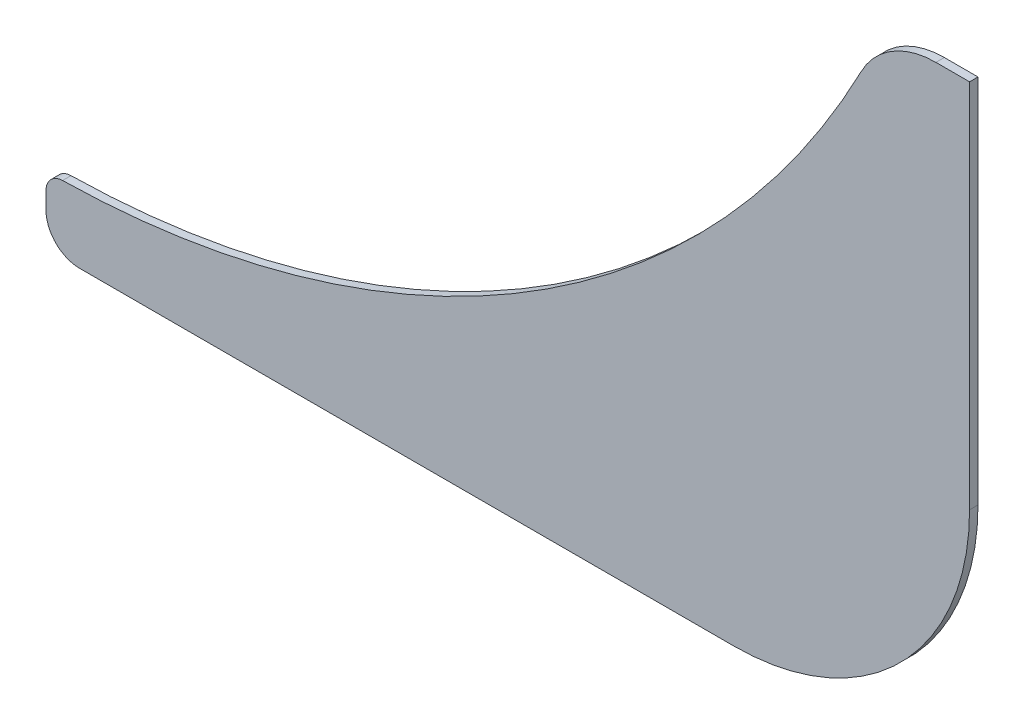
ISO-10303-21;
HEADER;
FILE_DESCRIPTION(('STEP AP214'),'2;1');
FILE_NAME('part.step','',(''),(''),'','','');
FILE_SCHEMA(('AUTOMOTIVE_DESIGN { 1 0 10303 214 1 1 1 1 }'));
ENDSEC;
DATA;
#1=APPLICATION_CONTEXT('core data for automotive mechanical design processes');
#2=APPLICATION_PROTOCOL_DEFINITION('international standard','automotive_design',2000,#1);
#3=PRODUCT_CONTEXT('',#1,'mechanical');
#4=PRODUCT('Part','Part','',(#3));
#5=PRODUCT_RELATED_PRODUCT_CATEGORY('part','',(#4));
#6=PRODUCT_DEFINITION_FORMATION('','',#4);
#7=PRODUCT_DEFINITION_CONTEXT('part definition',#1,'design');
#8=PRODUCT_DEFINITION('design','',#6,#7);
#9=PRODUCT_DEFINITION_SHAPE('','',#8);
#10=(LENGTH_UNIT() NAMED_UNIT(*) SI_UNIT(.MILLI.,.METRE.));
#11=(NAMED_UNIT(*) PLANE_ANGLE_UNIT() SI_UNIT($,.RADIAN.));
#12=(NAMED_UNIT(*) SI_UNIT($,.STERADIAN.) SOLID_ANGLE_UNIT());
#13=UNCERTAINTY_MEASURE_WITH_UNIT(LENGTH_MEASURE(1.E-05),#10,'distance_accuracy_value','');
#14=(GEOMETRIC_REPRESENTATION_CONTEXT(3) GLOBAL_UNCERTAINTY_ASSIGNED_CONTEXT((#13)) GLOBAL_UNIT_ASSIGNED_CONTEXT((#10,
#11,#12)) REPRESENTATION_CONTEXT('',''));
#15=CARTESIAN_POINT('',(0.,0.,0.));
#16=DIRECTION('',(0.,0.,1.));
#17=DIRECTION('',(1.,0.,0.));
#18=AXIS2_PLACEMENT_3D('',#15,#16,#17);
#19=CARTESIAN_POINT('',(-3.71924713249424E-13,170.179999999999,6.35));
#20=DIRECTION('',(0.,-1.,0.));
#21=DIRECTION('',(1.,0.,0.));
#22=AXIS2_PLACEMENT_3D('',#19,#20,#21);
#23=PLANE('',#22);
#24=DIRECTION('',(-1.,0.,0.));
#25=VECTOR('',#24,1.);
#26=CARTESIAN_POINT('',(-3.71924713249424E-13,170.179999999999,0.));
#27=LINE('',#26,#25);
#28=CARTESIAN_POINT('',(588.24881144586,170.18,0.));
#29=VERTEX_POINT('',#28);
#30=CARTESIAN_POINT('',(562.84881144586,170.18,0.));
#31=VERTEX_POINT('',#30);
#32=EDGE_CURVE('E129',#29,#31,#27,.T.);
#33=ORIENTED_EDGE('',*,*,#32,.T.);
#34=DIRECTION('',(0.,0.,-1.));
#35=VECTOR('',#34,1.);
#36=CARTESIAN_POINT('',(562.84881144586,170.18,6.35));
#37=LINE('',#36,#35);
#38=CARTESIAN_POINT('',(562.84881144586,170.18,6.35));
#39=VERTEX_POINT('',#38);
#40=EDGE_CURVE('E110',#39,#31,#37,.T.);
#41=ORIENTED_EDGE('',*,*,#40,.F.);
#42=DIRECTION('',(-1.,0.,0.));
#43=VECTOR('',#42,1.);
#44=CARTESIAN_POINT('',(-3.71924713249424E-13,170.179999999999,6.35));
#45=LINE('',#44,#43);
#46=CARTESIAN_POINT('',(588.24881144586,170.18,6.35));
#47=VERTEX_POINT('',#46);
#48=EDGE_CURVE('E116',#47,#39,#45,.T.);
#49=ORIENTED_EDGE('',*,*,#48,.F.);
#50=DIRECTION('',(0.,0.,-1.));
#51=VECTOR('',#50,1.);
#52=CARTESIAN_POINT('',(588.24881144586,170.18,6.35));
#53=LINE('',#52,#51);
#54=EDGE_CURVE('E147',#47,#29,#53,.T.);
#55=ORIENTED_EDGE('',*,*,#54,.T.);
#56=EDGE_LOOP('',(#33,#41,#49,#55));
#57=FACE_BOUND('',#56,.T.);
#58=ADVANCED_FACE('F35',(#57),#23,.F.);
#59=CARTESIAN_POINT('',(562.84881144586,106.68,6.35));
#60=DIRECTION('',(0.,0.,-1.));
#61=DIRECTION('',(-1.,0.,0.));
#62=AXIS2_PLACEMENT_3D('',#59,#60,#61);
#63=CYLINDRICAL_SURFACE('',#62,63.5);
#64=CARTESIAN_POINT('',(562.84881144586,106.68,0.));
#65=DIRECTION('',(0.,0.,1.));
#66=DIRECTION('',(1.,0.,0.));
#67=AXIS2_PLACEMENT_3D('',#64,#65,#66);
#68=CIRCLE('',#67,63.5);
#69=CARTESIAN_POINT('',(506.565274596258,136.080909504631,0.));
#70=VERTEX_POINT('',#69);
#71=EDGE_CURVE('E162',#31,#70,#68,.T.);
#72=ORIENTED_EDGE('',*,*,#71,.T.);
#73=DIRECTION('',(0.,0.,-1.));
#74=VECTOR('',#73,1.);
#75=CARTESIAN_POINT('',(506.565274596258,136.080909504631,6.35));
#76=LINE('',#75,#74);
#77=CARTESIAN_POINT('',(506.565274596258,136.080909504631,6.35));
#78=VERTEX_POINT('',#77);
#79=EDGE_CURVE('E113',#78,#70,#76,.T.);
#80=ORIENTED_EDGE('',*,*,#79,.F.);
#81=CARTESIAN_POINT('',(562.84881144586,106.68,6.35));
#82=DIRECTION('',(0.,0.,1.));
#83=DIRECTION('',(1.,0.,0.));
#84=AXIS2_PLACEMENT_3D('',#81,#82,#83);
#85=CIRCLE('',#84,63.5);
#86=EDGE_CURVE('E105',#39,#78,#85,.T.);
#87=ORIENTED_EDGE('',*,*,#86,.F.);
#88=ORIENTED_EDGE('',*,*,#40,.T.);
#89=EDGE_LOOP('',(#72,#80,#87,#88));
#90=FACE_BOUND('',#89,.T.);
#91=ADVANCED_FACE('F108',(#90),#63,.T.);
#92=CARTESIAN_POINT('',(-107.95,457.086109051646,6.35));
#93=DIRECTION('',(0.,0.,-1.));
#94=DIRECTION('',(-1.,0.,0.));
#95=AXIS2_PLACEMENT_3D('',#92,#93,#94);
#96=CYLINDRICAL_SURFACE('',#95,693.306109051646);
#97=CARTESIAN_POINT('',(-107.95,457.086109051646,0.));
#98=DIRECTION('',(0.,0.,1.));
#99=DIRECTION('',(1.,0.,0.));
#100=AXIS2_PLACEMENT_3D('',#97,#98,#99);
#101=CIRCLE('',#100,693.306109051646);
#102=CARTESIAN_POINT('',(-95.4784541138273,-236.107818642143,0.));
#103=VERTEX_POINT('',#102);
#104=EDGE_CURVE('E160',#103,#70,#101,.T.);
#105=ORIENTED_EDGE('',*,*,#104,.F.);
#106=DIRECTION('',(0.,0.,-1.));
#107=VECTOR('',#106,1.);
#108=CARTESIAN_POINT('',(-95.4784541138273,-236.107818642143,6.35));
#109=LINE('',#108,#107);
#110=CARTESIAN_POINT('',(-95.4784541138273,-236.107818642143,6.35));
#111=VERTEX_POINT('',#110);
#112=EDGE_CURVE('E43',#103,#111,#109,.F.);
#113=ORIENTED_EDGE('',*,*,#112,.T.);
#114=CARTESIAN_POINT('',(-107.95,457.086109051646,6.35));
#115=DIRECTION('',(0.,0.,1.));
#116=DIRECTION('',(1.,0.,0.));
#117=AXIS2_PLACEMENT_3D('',#114,#115,#116);
#118=CIRCLE('',#117,693.306109051646);
#119=EDGE_CURVE('E115',#111,#78,#118,.T.);
#120=ORIENTED_EDGE('',*,*,#119,.T.);
#121=ORIENTED_EDGE('',*,*,#79,.T.);
#122=EDGE_LOOP('',(#105,#113,#120,#121));
#123=FACE_BOUND('',#122,.T.);
#124=ADVANCED_FACE('F175',(#123),#96,.F.);
#125=CARTESIAN_POINT('',(-107.950000000001,-5.89805981832122E-13,6.35));
#126=DIRECTION('',(1.,0.,0.));
#127=DIRECTION('',(0.,1.,0.));
#128=AXIS2_PLACEMENT_3D('',#125,#126,#127);
#129=PLANE('',#128);
#130=DIRECTION('',(0.,-1.,0.));
#131=VECTOR('',#130,1.);
#132=CARTESIAN_POINT('',(-107.950000000001,-5.89805981832122E-13,6.35));
#133=LINE('',#132,#131);
#134=CARTESIAN_POINT('',(-107.95,-248.805763701005,6.35));
#135=VERTEX_POINT('',#134);
#136=CARTESIAN_POINT('',(-107.95,-261.62,6.35));
#137=VERTEX_POINT('',#136);
#138=EDGE_CURVE('E173',#135,#137,#133,.T.);
#139=ORIENTED_EDGE('',*,*,#138,.F.);
#140=DIRECTION('',(0.,0.,1.));
#141=VECTOR('',#140,1.);
#142=CARTESIAN_POINT('',(-107.95,-248.805763701005,0.));
#143=LINE('',#142,#141);
#144=CARTESIAN_POINT('',(-107.95,-248.805763701005,0.));
#145=VERTEX_POINT('',#144);
#146=EDGE_CURVE('E130',#135,#145,#143,.F.);
#147=ORIENTED_EDGE('',*,*,#146,.T.);
#148=DIRECTION('',(0.,-1.,0.));
#149=VECTOR('',#148,1.);
#150=CARTESIAN_POINT('',(-107.950000000001,-5.89805981832122E-13,0.));
#151=LINE('',#150,#149);
#152=CARTESIAN_POINT('',(-107.95,-261.62,0.));
#153=VERTEX_POINT('',#152);
#154=EDGE_CURVE('E158',#145,#153,#151,.T.);
#155=ORIENTED_EDGE('',*,*,#154,.T.);
#156=DIRECTION('',(0.,0.,-1.));
#157=VECTOR('',#156,1.);
#158=CARTESIAN_POINT('',(-107.95,-261.62,6.35));
#159=LINE('',#158,#157);
#160=EDGE_CURVE('E134',#137,#153,#159,.T.);
#161=ORIENTED_EDGE('',*,*,#160,.F.);
#162=EDGE_LOOP('',(#139,#147,#155,#161));
#163=FACE_BOUND('',#162,.T.);
#164=ADVANCED_FACE('F181',(#163),#129,.F.);
#165=CARTESIAN_POINT('',(-82.55,-261.62,6.35));
#166=DIRECTION('',(0.,0.,-1.));
#167=DIRECTION('',(-1.,0.,0.));
#168=AXIS2_PLACEMENT_3D('',#165,#166,#167);
#169=CYLINDRICAL_SURFACE('',#168,25.4);
#170=CARTESIAN_POINT('',(-82.55,-261.62,0.));
#171=DIRECTION('',(0.,0.,1.));
#172=DIRECTION('',(1.,0.,0.));
#173=AXIS2_PLACEMENT_3D('',#170,#171,#172);
#174=CIRCLE('',#173,25.4);
#175=CARTESIAN_POINT('',(-82.55,-287.02,0.));
#176=VERTEX_POINT('',#175);
#177=EDGE_CURVE('E156',#153,#176,#174,.T.);
#178=ORIENTED_EDGE('',*,*,#177,.T.);
#179=DIRECTION('',(0.,0.,-1.));
#180=VECTOR('',#179,1.);
#181=CARTESIAN_POINT('',(-82.55,-287.02,6.35));
#182=LINE('',#181,#180);
#183=CARTESIAN_POINT('',(-82.55,-287.02,6.35));
#184=VERTEX_POINT('',#183);
#185=EDGE_CURVE('E140',#184,#176,#182,.T.);
#186=ORIENTED_EDGE('',*,*,#185,.F.);
#187=CARTESIAN_POINT('',(-82.55,-261.62,6.35));
#188=DIRECTION('',(0.,0.,1.));
#189=DIRECTION('',(1.,0.,0.));
#190=AXIS2_PLACEMENT_3D('',#187,#188,#189);
#191=CIRCLE('',#190,25.4);
#192=EDGE_CURVE('E171',#137,#184,#191,.T.);
#193=ORIENTED_EDGE('',*,*,#192,.F.);
#194=ORIENTED_EDGE('',*,*,#160,.T.);
#195=EDGE_LOOP('',(#178,#186,#193,#194));
#196=FACE_BOUND('',#195,.T.);
#197=ADVANCED_FACE('F188',(#196),#169,.T.);
#198=CARTESIAN_POINT('',(0.,-287.02,6.35));
#199=DIRECTION('',(0.,1.,0.));
#200=DIRECTION('',(-1.,0.,0.));
#201=AXIS2_PLACEMENT_3D('',#198,#199,#200);
#202=PLANE('',#201);
#203=DIRECTION('',(1.,0.,0.));
#204=VECTOR('',#203,1.);
#205=CARTESIAN_POINT('',(0.,-287.02,0.));
#206=LINE('',#205,#204);
#207=CARTESIAN_POINT('',(410.44881144586,-287.02,0.));
#208=VERTEX_POINT('',#207);
#209=EDGE_CURVE('E153',#176,#208,#206,.T.);
#210=ORIENTED_EDGE('',*,*,#209,.T.);
#211=DIRECTION('',(0.,0.,-1.));
#212=VECTOR('',#211,1.);
#213=CARTESIAN_POINT('',(410.44881144586,-287.02,6.35));
#214=LINE('',#213,#212);
#215=CARTESIAN_POINT('',(410.44881144586,-287.02,6.35));
#216=VERTEX_POINT('',#215);
#217=EDGE_CURVE('E143',#216,#208,#214,.T.);
#218=ORIENTED_EDGE('',*,*,#217,.F.);
#219=DIRECTION('',(1.,0.,0.));
#220=VECTOR('',#219,1.);
#221=CARTESIAN_POINT('',(0.,-287.02,6.35));
#222=LINE('',#221,#220);
#223=EDGE_CURVE('E169',#184,#216,#222,.T.);
#224=ORIENTED_EDGE('',*,*,#223,.F.);
#225=ORIENTED_EDGE('',*,*,#185,.T.);
#226=EDGE_LOOP('',(#210,#218,#224,#225));
#227=FACE_BOUND('',#226,.T.);
#228=ADVANCED_FACE('F192',(#227),#202,.F.);
#229=CARTESIAN_POINT('',(410.44881144586,-109.22,6.35));
#230=DIRECTION('',(0.,0.,-1.));
#231=DIRECTION('',(-1.,0.,0.));
#232=AXIS2_PLACEMENT_3D('',#229,#230,#231);
#233=CYLINDRICAL_SURFACE('',#232,177.8);
#234=CARTESIAN_POINT('',(410.44881144586,-109.22,0.));
#235=DIRECTION('',(0.,0.,1.));
#236=DIRECTION('',(1.,0.,0.));
#237=AXIS2_PLACEMENT_3D('',#234,#235,#236);
#238=CIRCLE('',#237,177.8);
#239=CARTESIAN_POINT('',(588.24881144586,-109.22,0.));
#240=VERTEX_POINT('',#239);
#241=EDGE_CURVE('E150',#240,#208,#238,.F.);
#242=ORIENTED_EDGE('',*,*,#241,.F.);
#243=DIRECTION('',(0.,0.,-1.));
#244=VECTOR('',#243,1.);
#245=CARTESIAN_POINT('',(588.24881144586,-109.22,6.35));
#246=LINE('',#245,#244);
#247=CARTESIAN_POINT('',(588.24881144586,-109.22,6.35));
#248=VERTEX_POINT('',#247);
#249=EDGE_CURVE('E145',#248,#240,#246,.T.);
#250=ORIENTED_EDGE('',*,*,#249,.F.);
#251=CARTESIAN_POINT('',(410.44881144586,-109.22,6.35));
#252=DIRECTION('',(0.,0.,1.));
#253=DIRECTION('',(1.,0.,0.));
#254=AXIS2_PLACEMENT_3D('',#251,#252,#253);
#255=CIRCLE('',#254,177.8);
#256=EDGE_CURVE('E166',#248,#216,#255,.F.);
#257=ORIENTED_EDGE('',*,*,#256,.T.);
#258=ORIENTED_EDGE('',*,*,#217,.T.);
#259=EDGE_LOOP('',(#242,#250,#257,#258));
#260=FACE_BOUND('',#259,.T.);
#261=ADVANCED_FACE('F196',(#260),#233,.T.);
#262=CARTESIAN_POINT('',(588.24881144586,2.33746376047092E-13,6.35));
#263=DIRECTION('',(-1.,0.,0.));
#264=DIRECTION('',(0.,-1.,0.));
#265=AXIS2_PLACEMENT_3D('',#262,#263,#264);
#266=PLANE('',#265);
#267=DIRECTION('',(0.,1.,0.));
#268=VECTOR('',#267,1.);
#269=CARTESIAN_POINT('',(588.24881144586,2.33746376047092E-13,0.));
#270=LINE('',#269,#268);
#271=EDGE_CURVE('E126',#240,#29,#270,.T.);
#272=ORIENTED_EDGE('',*,*,#271,.T.);
#273=ORIENTED_EDGE('',*,*,#54,.F.);
#274=DIRECTION('',(0.,1.,0.));
#275=VECTOR('',#274,1.);
#276=CARTESIAN_POINT('',(588.24881144586,2.33746376047092E-13,6.35));
#277=LINE('',#276,#275);
#278=EDGE_CURVE('E122',#248,#47,#277,.T.);
#279=ORIENTED_EDGE('',*,*,#278,.F.);
#280=ORIENTED_EDGE('',*,*,#249,.T.);
#281=EDGE_LOOP('',(#272,#273,#279,#280));
#282=FACE_BOUND('',#281,.T.);
#283=ADVANCED_FACE('F199',(#282),#266,.F.);
#284=CARTESIAN_POINT('',(0.,0.,6.35));
#285=DIRECTION('',(0.,0.,1.));
#286=DIRECTION('',(1.,0.,0.));
#287=AXIS2_PLACEMENT_3D('',#284,#285,#286);
#288=PLANE('',#287);
#289=ORIENTED_EDGE('',*,*,#119,.F.);
#290=CARTESIAN_POINT('',(-95.25,-248.805763701005,6.35));
#291=DIRECTION('',(0.,0.,1.));
#292=DIRECTION('',(1.,0.,0.));
#293=AXIS2_PLACEMENT_3D('',#290,#291,#292);
#294=CIRCLE('',#293,12.7);
#295=EDGE_CURVE('E11',#111,#135,#294,.T.);
#296=ORIENTED_EDGE('',*,*,#295,.T.);
#297=ORIENTED_EDGE('',*,*,#138,.T.);
#298=ORIENTED_EDGE('',*,*,#192,.T.);
#299=ORIENTED_EDGE('',*,*,#223,.T.);
#300=ORIENTED_EDGE('',*,*,#256,.F.);
#301=ORIENTED_EDGE('',*,*,#278,.T.);
#302=ORIENTED_EDGE('',*,*,#48,.T.);
#303=ORIENTED_EDGE('',*,*,#86,.T.);
#304=EDGE_LOOP('',(#289,#296,#297,#298,#299,#300,#301,#302,#303));
#305=FACE_BOUND('',#304,.T.);
#306=ADVANCED_FACE('F119',(#305),#288,.T.);
#307=CARTESIAN_POINT('',(0.,0.,0.));
#308=DIRECTION('',(0.,0.,1.));
#309=DIRECTION('',(1.,0.,0.));
#310=AXIS2_PLACEMENT_3D('',#307,#308,#309);
#311=PLANE('',#310);
#312=ORIENTED_EDGE('',*,*,#154,.F.);
#313=CARTESIAN_POINT('',(-95.25,-248.805763701005,0.));
#314=DIRECTION('',(0.,0.,1.));
#315=DIRECTION('',(1.,0.,0.));
#316=AXIS2_PLACEMENT_3D('',#313,#314,#315);
#317=CIRCLE('',#316,12.7);
#318=EDGE_CURVE('E57',#145,#103,#317,.F.);
#319=ORIENTED_EDGE('',*,*,#318,.T.);
#320=ORIENTED_EDGE('',*,*,#104,.T.);
#321=ORIENTED_EDGE('',*,*,#71,.F.);
#322=ORIENTED_EDGE('',*,*,#32,.F.);
#323=ORIENTED_EDGE('',*,*,#271,.F.);
#324=ORIENTED_EDGE('',*,*,#241,.T.);
#325=ORIENTED_EDGE('',*,*,#209,.F.);
#326=ORIENTED_EDGE('',*,*,#177,.F.);
#327=EDGE_LOOP('',(#312,#319,#320,#321,#322,#323,#324,#325,#326));
#328=FACE_BOUND('',#327,.T.);
#329=ADVANCED_FACE('F184',(#328),#311,.F.);
#330=CARTESIAN_POINT('',(-95.25,-248.805763701005,6.35));
#331=DIRECTION('',(0.,0.,-1.));
#332=DIRECTION('',(-1.,0.,0.));
#333=AXIS2_PLACEMENT_3D('',#330,#331,#332);
#334=CYLINDRICAL_SURFACE('',#333,12.7);
#335=ORIENTED_EDGE('',*,*,#295,.F.);
#336=ORIENTED_EDGE('',*,*,#112,.F.);
#337=ORIENTED_EDGE('',*,*,#318,.F.);
#338=ORIENTED_EDGE('',*,*,#146,.F.);
#339=EDGE_LOOP('',(#335,#336,#337,#338));
#340=FACE_BOUND('',#339,.T.);
#341=ADVANCED_FACE('F37',(#340),#334,.T.);
#342=CLOSED_SHELL('',(#58,#91,#124,#164,#197,#228,#261,#283,#306,#329,#341));
#343=MANIFOLD_SOLID_BREP('B2',#342);
#344=ADVANCED_BREP_SHAPE_REPRESENTATION('',(#18,#343),#14);
#345=SHAPE_DEFINITION_REPRESENTATION(#9,#344);
ENDSEC;
END-ISO-10303-21;
